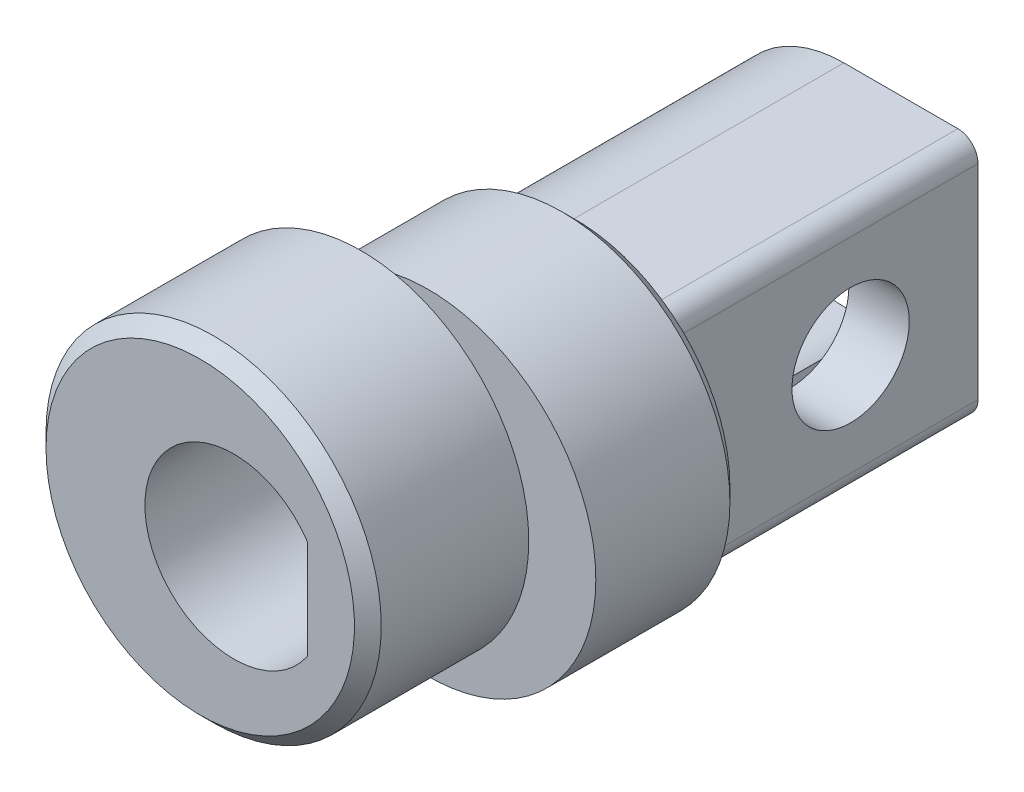
ISO-10303-21;
HEADER;
FILE_DESCRIPTION(('STEP AP214'),'2;1');
FILE_NAME('part.step','',(''),(''),'','','');
FILE_SCHEMA(('AUTOMOTIVE_DESIGN { 1 0 10303 214 1 1 1 1 }'));
ENDSEC;
DATA;
#1=APPLICATION_CONTEXT('core data for automotive mechanical design processes');
#2=APPLICATION_PROTOCOL_DEFINITION('international standard','automotive_design',2000,#1);
#3=PRODUCT_CONTEXT('',#1,'mechanical');
#4=PRODUCT('Part','Part','',(#3));
#5=PRODUCT_RELATED_PRODUCT_CATEGORY('part','',(#4));
#6=PRODUCT_DEFINITION_FORMATION('','',#4);
#7=PRODUCT_DEFINITION_CONTEXT('part definition',#1,'design');
#8=PRODUCT_DEFINITION('design','',#6,#7);
#9=PRODUCT_DEFINITION_SHAPE('','',#8);
#10=(LENGTH_UNIT() NAMED_UNIT(*) SI_UNIT(.MILLI.,.METRE.));
#11=(NAMED_UNIT(*) PLANE_ANGLE_UNIT() SI_UNIT($,.RADIAN.));
#12=(NAMED_UNIT(*) SI_UNIT($,.STERADIAN.) SOLID_ANGLE_UNIT());
#13=UNCERTAINTY_MEASURE_WITH_UNIT(LENGTH_MEASURE(1.E-05),#10,'distance_accuracy_value','');
#14=(GEOMETRIC_REPRESENTATION_CONTEXT(3) GLOBAL_UNCERTAINTY_ASSIGNED_CONTEXT((#13)) GLOBAL_UNIT_ASSIGNED_CONTEXT((#10,
#11,#12)) REPRESENTATION_CONTEXT('',''));
#15=CARTESIAN_POINT('',(0.,0.,0.));
#16=DIRECTION('',(0.,0.,1.));
#17=DIRECTION('',(1.,0.,0.));
#18=AXIS2_PLACEMENT_3D('',#15,#16,#17);
#19=CARTESIAN_POINT('',(2.2,-1.47732867026942,-8.79999999993873));
#20=DIRECTION('',(1.,0.,0.));
#21=DIRECTION('',(0.,1.,0.));
#22=AXIS2_PLACEMENT_3D('',#19,#20,#21);
#23=PLANE('',#22);
#24=DIRECTION('',(0.,0.,1.));
#25=VECTOR('',#24,1.);
#26=CARTESIAN_POINT('',(2.2,1.47732867026942,-8.79999999993873));
#27=LINE('',#26,#25);
#28=CARTESIAN_POINT('',(2.2,1.47732867026942,-4.06191684803533));
#29=VERTEX_POINT('',#28);
#30=CARTESIAN_POINT('',(2.2,1.47732867026942,9.4));
#31=VERTEX_POINT('',#30);
#32=EDGE_CURVE('E157',#29,#31,#27,.T.);
#33=ORIENTED_EDGE('',*,*,#32,.F.);
#34=CARTESIAN_POINT('',(2.2,0.,-5.));
#35=DIRECTION('',(1.,0.,0.));
#36=DIRECTION('',(0.,1.,0.));
#37=AXIS2_PLACEMENT_3D('',#34,#35,#36);
#38=CIRCLE('',#37,1.74999999999999);
#39=CARTESIAN_POINT('',(2.2,-1.47732867026942,-4.06191684803533));
#40=VERTEX_POINT('',#39);
#41=EDGE_CURVE('E135',#29,#40,#38,.T.);
#42=ORIENTED_EDGE('',*,*,#41,.T.);
#43=DIRECTION('',(0.,0.,1.));
#44=VECTOR('',#43,1.);
#45=CARTESIAN_POINT('',(2.2,-1.47732867026942,-8.79999999993873));
#46=LINE('',#45,#44);
#47=CARTESIAN_POINT('',(2.2,-1.47732867026942,9.4));
#48=VERTEX_POINT('',#47);
#49=EDGE_CURVE('E176',#40,#48,#46,.T.);
#50=ORIENTED_EDGE('',*,*,#49,.T.);
#51=DIRECTION('',(0.,1.,0.));
#52=VECTOR('',#51,1.);
#53=CARTESIAN_POINT('',(2.2,-1.47732867026942,9.4));
#54=LINE('',#53,#52);
#55=EDGE_CURVE('E159',#48,#31,#54,.T.);
#56=ORIENTED_EDGE('',*,*,#55,.T.);
#57=EDGE_LOOP('',(#33,#42,#50,#56));
#58=FACE_BOUND('',#57,.T.);
#59=ADVANCED_FACE('F43',(#58),#23,.F.);
#60=CARTESIAN_POINT('',(1.,0.,0.200000000013279));
#61=DIRECTION('',(0.,0.,1.));
#62=DIRECTION('',(1.,0.,0.));
#63=AXIS2_PLACEMENT_3D('',#60,#61,#62);
#64=PLANE('',#63);
#65=CARTESIAN_POINT('',(0.,0.,0.200000000013279));
#66=DIRECTION('',(0.,0.,-1.));
#67=DIRECTION('',(1.,0.,0.));
#68=AXIS2_PLACEMENT_3D('',#65,#66,#67);
#69=CIRCLE('',#68,3.65);
#70=CARTESIAN_POINT('',(-3.41875000020038,1.27853370551186,0.200000000013279));
#71=VERTEX_POINT('',#70);
#72=CARTESIAN_POINT('',(0.,3.65,0.200000000013279));
#73=VERTEX_POINT('',#72);
#74=EDGE_CURVE('E201',#71,#73,#69,.T.);
#75=ORIENTED_EDGE('',*,*,#74,.F.);
#76=CARTESIAN_POINT('',(1.,0.,0.200000000013279));
#77=DIRECTION('',(0.,0.,1.));
#78=DIRECTION('',(1.,0.,0.));
#79=AXIS2_PLACEMENT_3D('',#76,#77,#78);
#80=CIRCLE('',#79,4.60000000004356);
#81=CARTESIAN_POINT('',(-3.41875000020038,-1.27853370551186,0.200000000013279));
#82=VERTEX_POINT('',#81);
#83=EDGE_CURVE('E235',#71,#82,#80,.F.);
#84=ORIENTED_EDGE('',*,*,#83,.T.);
#85=CARTESIAN_POINT('',(0.,-3.65,0.200000000013279));
#86=VERTEX_POINT('',#85);
#87=EDGE_CURVE('E202',#86,#82,#69,.T.);
#88=ORIENTED_EDGE('',*,*,#87,.F.);
#89=DIRECTION('',(-1.,0.,0.));
#90=VECTOR('',#89,1.);
#91=CARTESIAN_POINT('',(0.,-3.65,0.200000000013279));
#92=LINE('',#91,#90);
#93=CARTESIAN_POINT('',(3.4,-3.65,0.200000000013279));
#94=VERTEX_POINT('',#93);
#95=EDGE_CURVE('E198',#94,#86,#92,.T.);
#96=ORIENTED_EDGE('',*,*,#95,.F.);
#97=CARTESIAN_POINT('',(3.4,-3.05,0.200000000013279));
#98=DIRECTION('',(0.,0.,-1.));
#99=DIRECTION('',(1.,0.,0.));
#100=AXIS2_PLACEMENT_3D('',#97,#98,#99);
#101=CIRCLE('',#100,0.6);
#102=CARTESIAN_POINT('',(4.,-3.05,0.200000000013279));
#103=VERTEX_POINT('',#102);
#104=EDGE_CURVE('E180',#103,#94,#101,.T.);
#105=ORIENTED_EDGE('',*,*,#104,.F.);
#106=DIRECTION('',(0.,-1.,0.));
#107=VECTOR('',#106,1.);
#108=CARTESIAN_POINT('',(4.,-3.05,0.200000000013279));
#109=LINE('',#108,#107);
#110=CARTESIAN_POINT('',(4.,3.05,0.200000000013279));
#111=VERTEX_POINT('',#110);
#112=EDGE_CURVE('E185',#111,#103,#109,.T.);
#113=ORIENTED_EDGE('',*,*,#112,.F.);
#114=CARTESIAN_POINT('',(3.4,3.05,0.200000000013279));
#115=DIRECTION('',(0.,0.,-1.));
#116=DIRECTION('',(1.,0.,0.));
#117=AXIS2_PLACEMENT_3D('',#114,#115,#116);
#118=CIRCLE('',#117,0.6);
#119=CARTESIAN_POINT('',(3.4,3.65,0.200000000013279));
#120=VERTEX_POINT('',#119);
#121=EDGE_CURVE('E207',#120,#111,#118,.T.);
#122=ORIENTED_EDGE('',*,*,#121,.F.);
#123=DIRECTION('',(1.,0.,0.));
#124=VECTOR('',#123,1.);
#125=CARTESIAN_POINT('',(3.4,3.65,0.200000000013279));
#126=LINE('',#125,#124);
#127=EDGE_CURVE('E204',#73,#120,#126,.T.);
#128=ORIENTED_EDGE('',*,*,#127,.F.);
#129=EDGE_LOOP('',(#75,#84,#88,#96,#105,#113,#122,#128));
#130=FACE_BOUND('',#129,.T.);
#131=ADVANCED_FACE('F277',(#130),#64,.F.);
#132=CARTESIAN_POINT('',(1.,0.,0.200000000013279));
#133=DIRECTION('',(0.,0.,1.));
#134=DIRECTION('',(1.,0.,0.));
#135=AXIS2_PLACEMENT_3D('',#132,#133,#134);
#136=CYLINDRICAL_SURFACE('',#135,5.);
#137=CARTESIAN_POINT('',(1.,0.,0.600000000026563));
#138=DIRECTION('',(0.,0.,1.));
#139=DIRECTION('',(1.,0.,0.));
#140=AXIS2_PLACEMENT_3D('',#137,#138,#139);
#141=CIRCLE('',#140,5.);
#142=CARTESIAN_POINT('',(6.,0.,0.600000000026563));
#143=VERTEX_POINT('',#142);
#144=EDGE_CURVE('E147',#143,#143,#141,.T.);
#145=ORIENTED_EDGE('',*,*,#144,.T.);
#146=EDGE_LOOP('',(#145));
#147=FACE_BOUND('',#146,.T.);
#148=CARTESIAN_POINT('',(1.,0.,4.6));
#149=DIRECTION('',(0.,0.,1.));
#150=DIRECTION('',(1.,0.,0.));
#151=AXIS2_PLACEMENT_3D('',#148,#149,#150);
#152=CIRCLE('',#151,5.);
#153=CARTESIAN_POINT('',(0.,4.89897948556636,4.6));
#154=VERTEX_POINT('',#153);
#155=CARTESIAN_POINT('',(0.,-4.89897948556636,4.6));
#156=VERTEX_POINT('',#155);
#157=EDGE_CURVE('E230',#154,#156,#152,.T.);
#158=ORIENTED_EDGE('',*,*,#157,.F.);
#159=EDGE_CURVE('E229',#156,#154,#152,.T.);
#160=ORIENTED_EDGE('',*,*,#159,.F.);
#161=EDGE_LOOP('',(#158,#160));
#162=FACE_BOUND('',#161,.T.);
#163=ADVANCED_FACE('F262',(#147,#162),#136,.T.);
#164=CARTESIAN_POINT('',(1.,0.,4.6));
#165=DIRECTION('',(0.,0.,1.));
#166=DIRECTION('',(1.,0.,0.));
#167=AXIS2_PLACEMENT_3D('',#164,#165,#166);
#168=PLANE('',#167);
#169=ORIENTED_EDGE('',*,*,#159,.T.);
#170=CARTESIAN_POINT('',(-1.,0.,4.6));
#171=DIRECTION('',(0.,0.,-1.));
#172=DIRECTION('',(-1.,0.,0.));
#173=AXIS2_PLACEMENT_3D('',#170,#171,#172);
#174=CIRCLE('',#173,5.);
#175=EDGE_CURVE('E177',#154,#156,#174,.T.);
#176=ORIENTED_EDGE('',*,*,#175,.T.);
#177=EDGE_LOOP('',(#169,#176));
#178=FACE_BOUND('',#177,.T.);
#179=ADVANCED_FACE('F260',(#178),#168,.T.);
#180=CARTESIAN_POINT('',(3.4,-3.05,-8.79999999993873));
#181=DIRECTION('',(0.,0.,1.));
#182=DIRECTION('',(1.,0.,0.));
#183=AXIS2_PLACEMENT_3D('',#180,#181,#182);
#184=CYLINDRICAL_SURFACE('',#183,0.6);
#185=ORIENTED_EDGE('',*,*,#104,.T.);
#186=DIRECTION('',(0.,0.,1.));
#187=VECTOR('',#186,1.);
#188=CARTESIAN_POINT('',(3.4,-3.65,-8.79999999993873));
#189=LINE('',#188,#187);
#190=CARTESIAN_POINT('',(3.4,-3.65,-8.79999999993873));
#191=VERTEX_POINT('',#190);
#192=EDGE_CURVE('E226',#191,#94,#189,.T.);
#193=ORIENTED_EDGE('',*,*,#192,.F.);
#194=CARTESIAN_POINT('',(3.4,-3.05,-8.79999999993873));
#195=DIRECTION('',(0.,0.,-1.));
#196=DIRECTION('',(1.,0.,0.));
#197=AXIS2_PLACEMENT_3D('',#194,#195,#196);
#198=CIRCLE('',#197,0.6);
#199=CARTESIAN_POINT('',(4.,-3.05,-8.79999999993873));
#200=VERTEX_POINT('',#199);
#201=EDGE_CURVE('E181',#200,#191,#198,.T.);
#202=ORIENTED_EDGE('',*,*,#201,.F.);
#203=DIRECTION('',(0.,0.,1.));
#204=VECTOR('',#203,1.);
#205=CARTESIAN_POINT('',(4.,-3.05,-8.79999999993873));
#206=LINE('',#205,#204);
#207=EDGE_CURVE('E195',#200,#103,#206,.T.);
#208=ORIENTED_EDGE('',*,*,#207,.T.);
#209=EDGE_LOOP('',(#185,#193,#202,#208));
#210=FACE_BOUND('',#209,.T.);
#211=ADVANCED_FACE('F317',(#210),#184,.T.);
#212=CARTESIAN_POINT('',(0.,-3.65,-8.79999999993873));
#213=DIRECTION('',(0.,1.,0.));
#214=DIRECTION('',(-1.,0.,0.));
#215=AXIS2_PLACEMENT_3D('',#212,#213,#214);
#216=PLANE('',#215);
#217=ORIENTED_EDGE('',*,*,#95,.T.);
#218=DIRECTION('',(0.,0.,1.));
#219=VECTOR('',#218,1.);
#220=CARTESIAN_POINT('',(0.,-3.65,-8.79999999993873));
#221=LINE('',#220,#219);
#222=CARTESIAN_POINT('',(0.,-3.65,-8.79999999993873));
#223=VERTEX_POINT('',#222);
#224=EDGE_CURVE('E223',#223,#86,#221,.T.);
#225=ORIENTED_EDGE('',*,*,#224,.F.);
#226=DIRECTION('',(-1.,0.,0.));
#227=VECTOR('',#226,1.);
#228=CARTESIAN_POINT('',(0.,-3.65,-8.79999999993873));
#229=LINE('',#228,#227);
#230=EDGE_CURVE('E184',#191,#223,#229,.T.);
#231=ORIENTED_EDGE('',*,*,#230,.F.);
#232=ORIENTED_EDGE('',*,*,#192,.T.);
#233=EDGE_LOOP('',(#217,#225,#231,#232));
#234=FACE_BOUND('',#233,.T.);
#235=ADVANCED_FACE('F350',(#234),#216,.F.);
#236=CARTESIAN_POINT('',(0.,0.,-8.79999999993873));
#237=DIRECTION('',(0.,0.,1.));
#238=DIRECTION('',(1.,0.,0.));
#239=AXIS2_PLACEMENT_3D('',#236,#237,#238);
#240=CYLINDRICAL_SURFACE('',#239,3.65);
#241=ORIENTED_EDGE('',*,*,#87,.T.);
#242=CARTESIAN_POINT('',(-3.41875000020038,-1.27853370551186,0.200000000013279));
#243=CARTESIAN_POINT('',(-3.45967370348804,-1.1691695558301,0.208894598376842));
#244=CARTESIAN_POINT('',(-3.49533977236603,-1.05774128005627,0.21662406553088));
#245=CARTESIAN_POINT('',(-3.5558619160303,-0.831849879054776,0.229716115987289));
#246=CARTESIAN_POINT('',(-3.58071787257249,-0.717386720645222,0.235078673399737));
#247=CARTESIAN_POINT('',(-3.61866706036922,-0.490450837581672,0.243258452251931));
#248=CARTESIAN_POINT('',(-3.63213190345893,-0.378042995143227,0.246156105338791));
#249=CARTESIAN_POINT('',(-3.64856748236755,-0.152444003385284,0.249692298238168));
#250=CARTESIAN_POINT('',(-3.65154024018086,-0.0392530092051546,0.250331273334473));
#251=CARTESIAN_POINT('',(-3.64720695660394,0.175009525009378,0.249399305409341));
#252=CARTESIAN_POINT('',(-3.64094815843977,0.276104778540707,0.248053519043104));
#253=CARTESIAN_POINT('',(-3.62006063919561,0.477387915950801,0.243557492490838));
#254=CARTESIAN_POINT('',(-3.60543199783508,0.577575808462591,0.240407269491358));
#255=CARTESIAN_POINT('',(-3.56732764245644,0.779453618565243,0.23218883998216));
#256=CARTESIAN_POINT('',(-3.54358763394376,0.881091361422951,0.227063315251927));
#257=CARTESIAN_POINT('',(-3.48754006038665,1.08187663465924,0.214933805253955));
#258=CARTESIAN_POINT('',(-3.45523132831603,1.18102382381916,0.207929564111008));
#259=CARTESIAN_POINT('',(-3.41875000020038,1.27853370551186,0.200000000013279));
#260=B_SPLINE_CURVE_WITH_KNOTS('',3,(#242,#243,#244,#245,#246,#247,#248,#249,#250,#251,#252,
#253,#254,#255,#256,#257,#258,#259),.UNSPECIFIED.,.F.,.F.,(4,2,2,2,2,2,2,2,4),(0.,
0.351190323558694,0.702384488440639,1.0416236621854,1.38079745548809,1.68433186358887,
1.98786338069212,2.3009610036571,2.61410129119558),.UNSPECIFIED.);
#261=EDGE_CURVE('E11',#82,#71,#260,.T.);
#262=ORIENTED_EDGE('',*,*,#261,.T.);
#263=ORIENTED_EDGE('',*,*,#74,.T.);
#264=DIRECTION('',(0.,0.,1.));
#265=VECTOR('',#264,1.);
#266=CARTESIAN_POINT('',(0.,3.65,-8.79999999993873));
#267=LINE('',#266,#265);
#268=CARTESIAN_POINT('',(0.,3.65,-8.79999999993873));
#269=VERTEX_POINT('',#268);
#270=EDGE_CURVE('E220',#269,#73,#267,.T.);
#271=ORIENTED_EDGE('',*,*,#270,.F.);
#272=CARTESIAN_POINT('',(0.,0.,-8.79999999993873));
#273=DIRECTION('',(0.,0.,-1.));
#274=DIRECTION('',(1.,0.,0.));
#275=AXIS2_PLACEMENT_3D('',#272,#273,#274);
#276=CIRCLE('',#275,3.65);
#277=EDGE_CURVE('E187',#223,#269,#276,.T.);
#278=ORIENTED_EDGE('',*,*,#277,.F.);
#279=ORIENTED_EDGE('',*,*,#224,.T.);
#280=EDGE_LOOP('',(#241,#262,#263,#271,#278,#279));
#281=FACE_BOUND('',#280,.T.);
#282=ADVANCED_FACE('F330',(#281),#240,.T.);
#283=CARTESIAN_POINT('',(3.4,3.65,-8.79999999993873));
#284=DIRECTION('',(0.,-1.,0.));
#285=DIRECTION('',(0.,0.,-1.));
#286=AXIS2_PLACEMENT_3D('',#283,#284,#285);
#287=PLANE('',#286);
#288=ORIENTED_EDGE('',*,*,#127,.T.);
#289=DIRECTION('',(0.,0.,1.));
#290=VECTOR('',#289,1.);
#291=CARTESIAN_POINT('',(3.4,3.65,-8.79999999993873));
#292=LINE('',#291,#290);
#293=CARTESIAN_POINT('',(3.4,3.65,-8.79999999993873));
#294=VERTEX_POINT('',#293);
#295=EDGE_CURVE('E217',#294,#120,#292,.T.);
#296=ORIENTED_EDGE('',*,*,#295,.F.);
#297=DIRECTION('',(1.,0.,0.));
#298=VECTOR('',#297,1.);
#299=CARTESIAN_POINT('',(3.4,3.65,-8.79999999993873));
#300=LINE('',#299,#298);
#301=EDGE_CURVE('E189',#269,#294,#300,.T.);
#302=ORIENTED_EDGE('',*,*,#301,.F.);
#303=ORIENTED_EDGE('',*,*,#270,.T.);
#304=EDGE_LOOP('',(#288,#296,#302,#303));
#305=FACE_BOUND('',#304,.T.);
#306=ADVANCED_FACE('F327',(#305),#287,.F.);
#307=CARTESIAN_POINT('',(3.4,3.05,-8.79999999993873));
#308=DIRECTION('',(0.,0.,1.));
#309=DIRECTION('',(1.,0.,0.));
#310=AXIS2_PLACEMENT_3D('',#307,#308,#309);
#311=CYLINDRICAL_SURFACE('',#310,0.6);
#312=ORIENTED_EDGE('',*,*,#121,.T.);
#313=DIRECTION('',(0.,0.,1.));
#314=VECTOR('',#313,1.);
#315=CARTESIAN_POINT('',(4.,3.05,-8.79999999993873));
#316=LINE('',#315,#314);
#317=CARTESIAN_POINT('',(4.,3.05,-8.79999999993873));
#318=VERTEX_POINT('',#317);
#319=EDGE_CURVE('E214',#318,#111,#316,.T.);
#320=ORIENTED_EDGE('',*,*,#319,.F.);
#321=CARTESIAN_POINT('',(3.4,3.05,-8.79999999993873));
#322=DIRECTION('',(0.,0.,-1.));
#323=DIRECTION('',(1.,0.,0.));
#324=AXIS2_PLACEMENT_3D('',#321,#322,#323);
#325=CIRCLE('',#324,0.6);
#326=EDGE_CURVE('E191',#294,#318,#325,.T.);
#327=ORIENTED_EDGE('',*,*,#326,.F.);
#328=ORIENTED_EDGE('',*,*,#295,.T.);
#329=EDGE_LOOP('',(#312,#320,#327,#328));
#330=FACE_BOUND('',#329,.T.);
#331=ADVANCED_FACE('F310',(#330),#311,.T.);
#332=CARTESIAN_POINT('',(4.,-3.05,-8.79999999993873));
#333=DIRECTION('',(-1.,0.,0.));
#334=DIRECTION('',(0.,0.,1.));
#335=AXIS2_PLACEMENT_3D('',#332,#333,#334);
#336=PLANE('',#335);
#337=CARTESIAN_POINT('',(4.,0.,-5.));
#338=DIRECTION('',(1.,0.,0.));
#339=DIRECTION('',(0.,0.,-1.));
#340=AXIS2_PLACEMENT_3D('',#337,#338,#339);
#341=CIRCLE('',#340,1.74999999999999);
#342=CARTESIAN_POINT('',(4.,0.,-6.74999999999999));
#343=VERTEX_POINT('',#342);
#344=EDGE_CURVE('E304',#343,#343,#341,.T.);
#345=ORIENTED_EDGE('',*,*,#344,.F.);
#346=EDGE_LOOP('',(#345));
#347=FACE_BOUND('',#346,.T.);
#348=ORIENTED_EDGE('',*,*,#112,.T.);
#349=ORIENTED_EDGE('',*,*,#207,.F.);
#350=DIRECTION('',(0.,-1.,0.));
#351=VECTOR('',#350,1.);
#352=CARTESIAN_POINT('',(4.,-3.05,-8.79999999993873));
#353=LINE('',#352,#351);
#354=EDGE_CURVE('E193',#318,#200,#353,.T.);
#355=ORIENTED_EDGE('',*,*,#354,.F.);
#356=ORIENTED_EDGE('',*,*,#319,.T.);
#357=EDGE_LOOP('',(#348,#349,#355,#356));
#358=FACE_BOUND('',#357,.T.);
#359=ADVANCED_FACE('F308',(#347,#358),#336,.F.);
#360=CARTESIAN_POINT('',(3.4,-3.05,-8.79999999993873));
#361=DIRECTION('',(0.,0.,1.));
#362=DIRECTION('',(1.,0.,0.));
#363=AXIS2_PLACEMENT_3D('',#360,#361,#362);
#364=PLANE('',#363);
#365=DIRECTION('',(0.,1.,0.));
#366=VECTOR('',#365,1.);
#367=CARTESIAN_POINT('',(2.2,-1.47732867026942,-8.79999999993873));
#368=LINE('',#367,#366);
#369=CARTESIAN_POINT('',(2.2,-1.47732867026942,-8.79999999993873));
#370=VERTEX_POINT('',#369);
#371=CARTESIAN_POINT('',(2.2,1.47732867026942,-8.79999999993873));
#372=VERTEX_POINT('',#371);
#373=EDGE_CURVE('E296',#370,#372,#368,.T.);
#374=ORIENTED_EDGE('',*,*,#373,.T.);
#375=CARTESIAN_POINT('',(0.,0.,-8.79999999993873));
#376=DIRECTION('',(0.,0.,1.));
#377=DIRECTION('',(1.,0.,0.));
#378=AXIS2_PLACEMENT_3D('',#375,#376,#377);
#379=CIRCLE('',#378,2.65);
#380=EDGE_CURVE('E299',#372,#370,#379,.T.);
#381=ORIENTED_EDGE('',*,*,#380,.T.);
#382=EDGE_LOOP('',(#374,#381));
#383=FACE_BOUND('',#382,.T.);
#384=ORIENTED_EDGE('',*,*,#201,.T.);
#385=ORIENTED_EDGE('',*,*,#230,.T.);
#386=ORIENTED_EDGE('',*,*,#277,.T.);
#387=ORIENTED_EDGE('',*,*,#301,.T.);
#388=ORIENTED_EDGE('',*,*,#326,.T.);
#389=ORIENTED_EDGE('',*,*,#354,.T.);
#390=EDGE_LOOP('',(#384,#385,#386,#387,#388,#389));
#391=FACE_BOUND('',#390,.T.);
#392=ADVANCED_FACE('F253',(#383,#391),#364,.F.);
#393=CARTESIAN_POINT('',(-1.,0.,9.4));
#394=DIRECTION('',(0.,0.,-1.));
#395=DIRECTION('',(-1.,0.,0.));
#396=AXIS2_PLACEMENT_3D('',#393,#394,#395);
#397=CYLINDRICAL_SURFACE('',#396,5.);
#398=CARTESIAN_POINT('',(-1.,0.,8.99999999998672));
#399=DIRECTION('',(0.,0.,-1.));
#400=DIRECTION('',(-1.,0.,0.));
#401=AXIS2_PLACEMENT_3D('',#398,#399,#400);
#402=CIRCLE('',#401,5.);
#403=CARTESIAN_POINT('',(-6.,0.,8.99999999998672));
#404=VERTEX_POINT('',#403);
#405=EDGE_CURVE('E237',#404,#404,#402,.T.);
#406=ORIENTED_EDGE('',*,*,#405,.T.);
#407=EDGE_LOOP('',(#406));
#408=FACE_BOUND('',#407,.T.);
#409=ORIENTED_EDGE('',*,*,#175,.F.);
#410=EDGE_CURVE('E169',#156,#154,#174,.T.);
#411=ORIENTED_EDGE('',*,*,#410,.F.);
#412=EDGE_LOOP('',(#409,#411));
#413=FACE_BOUND('',#412,.T.);
#414=ADVANCED_FACE('F250',(#408,#413),#397,.T.);
#415=CARTESIAN_POINT('',(-1.,0.,9.4));
#416=DIRECTION('',(0.,0.,-1.));
#417=DIRECTION('',(-1.,0.,0.));
#418=AXIS2_PLACEMENT_3D('',#415,#416,#417);
#419=PLANE('',#418);
#420=CARTESIAN_POINT('',(-1.,0.,9.4));
#421=DIRECTION('',(0.,0.,-1.));
#422=DIRECTION('',(-1.,0.,0.));
#423=AXIS2_PLACEMENT_3D('',#420,#421,#422);
#424=CIRCLE('',#423,4.60000000004356);
#425=CARTESIAN_POINT('',(-5.60000000004356,0.,9.4));
#426=VERTEX_POINT('',#425);
#427=EDGE_CURVE('E57',#426,#426,#424,.F.);
#428=ORIENTED_EDGE('',*,*,#427,.T.);
#429=EDGE_LOOP('',(#428));
#430=FACE_BOUND('',#429,.T.);
#431=ORIENTED_EDGE('',*,*,#55,.F.);
#432=CARTESIAN_POINT('',(0.,0.,9.4));
#433=DIRECTION('',(0.,0.,1.));
#434=DIRECTION('',(1.,0.,0.));
#435=AXIS2_PLACEMENT_3D('',#432,#433,#434);
#436=CIRCLE('',#435,2.65);
#437=EDGE_CURVE('E154',#31,#48,#436,.T.);
#438=ORIENTED_EDGE('',*,*,#437,.F.);
#439=EDGE_LOOP('',(#431,#438));
#440=FACE_BOUND('',#439,.T.);
#441=ADVANCED_FACE('F242',(#430,#440),#419,.F.);
#442=CARTESIAN_POINT('',(-1.,0.,4.6));
#443=DIRECTION('',(0.,0.,-1.));
#444=DIRECTION('',(-1.,0.,0.));
#445=AXIS2_PLACEMENT_3D('',#442,#443,#444);
#446=PLANE('',#445);
#447=ORIENTED_EDGE('',*,*,#410,.T.);
#448=ORIENTED_EDGE('',*,*,#157,.T.);
#449=EDGE_LOOP('',(#447,#448));
#450=FACE_BOUND('',#449,.T.);
#451=ADVANCED_FACE('F264',(#450),#446,.T.);
#452=CARTESIAN_POINT('',(0.,0.,-8.79999999993873));
#453=DIRECTION('',(0.,0.,1.));
#454=DIRECTION('',(1.,0.,0.));
#455=AXIS2_PLACEMENT_3D('',#452,#453,#454);
#456=CYLINDRICAL_SURFACE('',#455,2.65);
#457=ORIENTED_EDGE('',*,*,#437,.T.);
#458=ORIENTED_EDGE('',*,*,#49,.F.);
#459=CARTESIAN_POINT('',(2.2,-1.47732867026942,-5.93808315196467));
#460=VERTEX_POINT('',#459);
#461=EDGE_CURVE('E175',#460,#40,#46,.T.);
#462=ORIENTED_EDGE('',*,*,#461,.F.);
#463=EDGE_CURVE('E163',#370,#460,#46,.T.);
#464=ORIENTED_EDGE('',*,*,#463,.F.);
#465=ORIENTED_EDGE('',*,*,#380,.F.);
#466=CARTESIAN_POINT('',(2.2,1.47732867026942,-5.93808315196467));
#467=VERTEX_POINT('',#466);
#468=EDGE_CURVE('E165',#372,#467,#27,.T.);
#469=ORIENTED_EDGE('',*,*,#468,.T.);
#470=EDGE_CURVE('E153',#467,#29,#27,.T.);
#471=ORIENTED_EDGE('',*,*,#470,.T.);
#472=ORIENTED_EDGE('',*,*,#32,.T.);
#473=EDGE_LOOP('',(#457,#458,#462,#464,#465,#469,#471,#472));
#474=FACE_BOUND('',#473,.T.);
#475=ADVANCED_FACE('F167',(#474),#456,.F.);
#476=ORIENTED_EDGE('',*,*,#463,.T.);
#477=EDGE_CURVE('E148',#460,#467,#38,.T.);
#478=ORIENTED_EDGE('',*,*,#477,.T.);
#479=ORIENTED_EDGE('',*,*,#468,.F.);
#480=ORIENTED_EDGE('',*,*,#373,.F.);
#481=EDGE_LOOP('',(#476,#478,#479,#480));
#482=FACE_BOUND('',#481,.T.);
#483=ADVANCED_FACE('F272',(#482),#23,.F.);
#484=CARTESIAN_POINT('',(2.2,-1.47732867026942,-8.79999999993873));
#485=DIRECTION('',(1.,0.,0.));
#486=DIRECTION('',(0.,1.,0.));
#487=AXIS2_PLACEMENT_3D('',#484,#485,#486);
#488=PLANE('',#487);
#489=ORIENTED_EDGE('',*,*,#461,.T.);
#490=CARTESIAN_POINT('',(2.2,0.,-5.));
#491=DIRECTION('',(1.,0.,0.));
#492=DIRECTION('',(0.,1.,0.));
#493=AXIS2_PLACEMENT_3D('',#490,#491,#492);
#494=CIRCLE('',#493,1.74999999999999);
#495=EDGE_CURVE('E142',#460,#40,#494,.F.);
#496=ORIENTED_EDGE('',*,*,#495,.F.);
#497=EDGE_LOOP('',(#489,#496));
#498=FACE_BOUND('',#497,.T.);
#499=ADVANCED_FACE('F287',(#498),#488,.T.);
#500=CARTESIAN_POINT('',(4.,0.,-5.));
#501=DIRECTION('',(1.,0.,0.));
#502=DIRECTION('',(0.,0.,-1.));
#503=AXIS2_PLACEMENT_3D('',#500,#501,#502);
#504=CYLINDRICAL_SURFACE('',#503,1.74999999999999);
#505=ORIENTED_EDGE('',*,*,#495,.T.);
#506=ORIENTED_EDGE('',*,*,#41,.F.);
#507=EDGE_CURVE('E139',#29,#467,#494,.F.);
#508=ORIENTED_EDGE('',*,*,#507,.T.);
#509=ORIENTED_EDGE('',*,*,#477,.F.);
#510=EDGE_LOOP('',(#505,#506,#508,#509));
#511=FACE_BOUND('',#510,.T.);
#512=ORIENTED_EDGE('',*,*,#344,.T.);
#513=EDGE_LOOP('',(#512));
#514=FACE_BOUND('',#513,.T.);
#515=ADVANCED_FACE('F137',(#511,#514),#504,.F.);
#516=ORIENTED_EDGE('',*,*,#507,.F.);
#517=ORIENTED_EDGE('',*,*,#470,.F.);
#518=EDGE_LOOP('',(#516,#517));
#519=FACE_BOUND('',#518,.T.);
#520=ADVANCED_FACE('F151',(#519),#488,.T.);
#521=CARTESIAN_POINT('',(1.,0.,0.600000000026563));
#522=DIRECTION('',(0.,0.,1.));
#523=DIRECTION('',(1.,0.,0.));
#524=AXIS2_PLACEMENT_3D('',#521,#522,#523);
#525=CONICAL_SURFACE('',#524,5.,0.78539816332639);
#526=ORIENTED_EDGE('',*,*,#261,.F.);
#527=ORIENTED_EDGE('',*,*,#83,.F.);
#528=EDGE_LOOP('',(#526,#527));
#529=FACE_BOUND('',#528,.T.);
#530=ORIENTED_EDGE('',*,*,#144,.F.);
#531=EDGE_LOOP('',(#530));
#532=FACE_BOUND('',#531,.T.);
#533=ADVANCED_FACE('F247',(#529,#532),#525,.T.);
#534=CARTESIAN_POINT('',(-1.,0.,8.99999999998672));
#535=DIRECTION('',(0.,0.,-1.));
#536=DIRECTION('',(-1.,0.,0.));
#537=AXIS2_PLACEMENT_3D('',#534,#535,#536);
#538=CONICAL_SURFACE('',#537,5.,0.785398163326397);
#539=ORIENTED_EDGE('',*,*,#427,.F.);
#540=EDGE_LOOP('',(#539));
#541=FACE_BOUND('',#540,.T.);
#542=ORIENTED_EDGE('',*,*,#405,.F.);
#543=EDGE_LOOP('',(#542));
#544=FACE_BOUND('',#543,.T.);
#545=ADVANCED_FACE('F46',(#541,#544),#538,.T.);
#546=CLOSED_SHELL('',(#59,#131,#163,#179,#211,#235,#282,#306,#331,#359,#392,#414,#441,#451,#475,
#483,#499,#515,#520,#533,#545));
#547=MANIFOLD_SOLID_BREP('B2',#546);
#548=ADVANCED_BREP_SHAPE_REPRESENTATION('',(#18,#547),#14);
#549=SHAPE_DEFINITION_REPRESENTATION(#9,#548);
ENDSEC;
END-ISO-10303-21;
